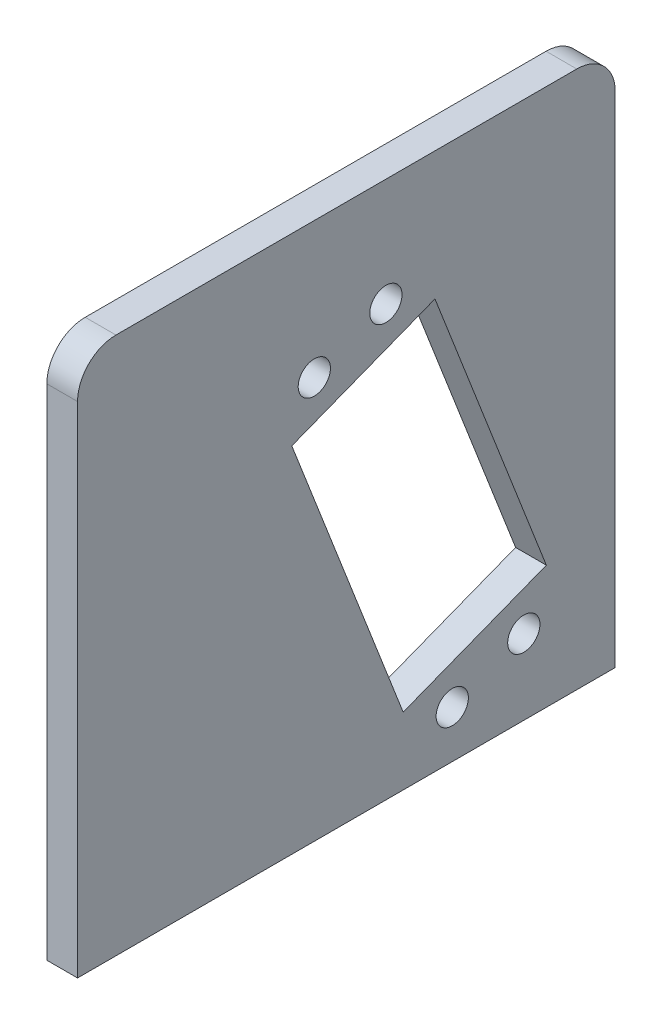
ISO-10303-21;
HEADER;
FILE_DESCRIPTION(('STEP AP214'),'2;1');
FILE_NAME('part.step','',(''),(''),'','','');
FILE_SCHEMA(('AUTOMOTIVE_DESIGN { 1 0 10303 214 1 1 1 1 }'));
ENDSEC;
DATA;
#1=APPLICATION_CONTEXT('core data for automotive mechanical design processes');
#2=APPLICATION_PROTOCOL_DEFINITION('international standard','automotive_design',2000,#1);
#3=PRODUCT_CONTEXT('',#1,'mechanical');
#4=PRODUCT('Part','Part','',(#3));
#5=PRODUCT_RELATED_PRODUCT_CATEGORY('part','',(#4));
#6=PRODUCT_DEFINITION_FORMATION('','',#4);
#7=PRODUCT_DEFINITION_CONTEXT('part definition',#1,'design');
#8=PRODUCT_DEFINITION('design','',#6,#7);
#9=PRODUCT_DEFINITION_SHAPE('','',#8);
#10=(LENGTH_UNIT() NAMED_UNIT(*) SI_UNIT(.MILLI.,.METRE.));
#11=(NAMED_UNIT(*) PLANE_ANGLE_UNIT() SI_UNIT($,.RADIAN.));
#12=(NAMED_UNIT(*) SI_UNIT($,.STERADIAN.) SOLID_ANGLE_UNIT());
#13=UNCERTAINTY_MEASURE_WITH_UNIT(LENGTH_MEASURE(1.E-05),#10,'distance_accuracy_value','');
#14=(GEOMETRIC_REPRESENTATION_CONTEXT(3) GLOBAL_UNCERTAINTY_ASSIGNED_CONTEXT((#13)) GLOBAL_UNIT_ASSIGNED_CONTEXT((#10,
#11,#12)) REPRESENTATION_CONTEXT('',''));
#15=CARTESIAN_POINT('',(0.,0.,0.));
#16=DIRECTION('',(0.,0.,1.));
#17=DIRECTION('',(1.,0.,0.));
#18=AXIS2_PLACEMENT_3D('',#15,#16,#17);
#19=CARTESIAN_POINT('',(0.,0.,0.));
#20=DIRECTION('',(0.,1.,0.));
#21=DIRECTION('',(0.,0.,1.));
#22=AXIS2_PLACEMENT_3D('',#19,#20,#21);
#23=PLANE('',#22);
#24=DIRECTION('',(0.,0.,1.));
#25=VECTOR('',#24,1.);
#26=CARTESIAN_POINT('',(35.2286949676816,0.,0.));
#27=LINE('',#26,#25);
#28=CARTESIAN_POINT('',(35.2286949676816,0.,-39.2125486187539));
#29=VERTEX_POINT('',#28);
#30=CARTESIAN_POINT('',(35.2286949676816,0.,30.7874513812461));
#31=VERTEX_POINT('',#30);
#32=EDGE_CURVE('E171',#29,#31,#27,.T.);
#33=ORIENTED_EDGE('',*,*,#32,.F.);
#34=DIRECTION('',(-1.,0.,0.));
#35=VECTOR('',#34,1.);
#36=CARTESIAN_POINT('',(0.,0.,-39.2125486187539));
#37=LINE('',#36,#35);
#38=CARTESIAN_POINT('',(39.2286949676816,0.,-39.2125486187539));
#39=VERTEX_POINT('',#38);
#40=EDGE_CURVE('E180',#39,#29,#37,.T.);
#41=ORIENTED_EDGE('',*,*,#40,.F.);
#42=DIRECTION('',(0.,0.,1.));
#43=VECTOR('',#42,1.);
#44=CARTESIAN_POINT('',(39.2286949676817,0.,0.));
#45=LINE('',#44,#43);
#46=CARTESIAN_POINT('',(39.2286949676817,0.,30.7874513812461));
#47=VERTEX_POINT('',#46);
#48=EDGE_CURVE('E177',#39,#47,#45,.T.);
#49=ORIENTED_EDGE('',*,*,#48,.T.);
#50=DIRECTION('',(1.,0.,0.));
#51=VECTOR('',#50,1.);
#52=CARTESIAN_POINT('',(0.,0.,30.7874513812461));
#53=LINE('',#52,#51);
#54=EDGE_CURVE('E174',#31,#47,#53,.T.);
#55=ORIENTED_EDGE('',*,*,#54,.F.);
#56=EDGE_LOOP('',(#33,#41,#49,#55));
#57=FACE_BOUND('',#56,.T.);
#58=ADVANCED_FACE('F37',(#57),#23,.F.);
#59=CARTESIAN_POINT('',(0.,3.,30.7874513812461));
#60=DIRECTION('',(0.,0.,-1.));
#61=DIRECTION('',(-1.,0.,0.));
#62=AXIS2_PLACEMENT_3D('',#59,#60,#61);
#63=PLANE('',#62);
#64=DIRECTION('',(0.,-1.,0.));
#65=VECTOR('',#64,1.);
#66=CARTESIAN_POINT('',(39.2286949676817,3.,30.7874513812461));
#67=LINE('',#66,#65);
#68=CARTESIAN_POINT('',(39.2286949676817,65.,30.7874513812461));
#69=VERTEX_POINT('',#68);
#70=EDGE_CURVE('E187',#69,#47,#67,.T.);
#71=ORIENTED_EDGE('',*,*,#70,.F.);
#72=DIRECTION('',(1.,0.,0.));
#73=VECTOR('',#72,1.);
#74=CARTESIAN_POINT('',(35.2286949676816,65.,30.7874513812461));
#75=LINE('',#74,#73);
#76=CARTESIAN_POINT('',(35.2286949676816,65.,30.7874513812461));
#77=VERTEX_POINT('',#76);
#78=EDGE_CURVE('E11',#69,#77,#75,.F.);
#79=ORIENTED_EDGE('',*,*,#78,.T.);
#80=DIRECTION('',(0.,-1.,0.));
#81=VECTOR('',#80,1.);
#82=CARTESIAN_POINT('',(35.2286949676816,3.,30.7874513812461));
#83=LINE('',#82,#81);
#84=EDGE_CURVE('E189',#77,#31,#83,.T.);
#85=ORIENTED_EDGE('',*,*,#84,.T.);
#86=ORIENTED_EDGE('',*,*,#54,.T.);
#87=EDGE_LOOP('',(#71,#79,#85,#86));
#88=FACE_BOUND('',#87,.T.);
#89=ADVANCED_FACE('F232',(#88),#63,.F.);
#90=CARTESIAN_POINT('',(0.,65.,25.7874513812461));
#91=DIRECTION('',(-1.,0.,0.));
#92=DIRECTION('',(0.,0.,1.));
#93=AXIS2_PLACEMENT_3D('',#90,#91,#92);
#94=CYLINDRICAL_SURFACE('',#93,5.);
#95=CARTESIAN_POINT('',(35.2286949676816,65.,25.7874513812461));
#96=DIRECTION('',(1.,0.,0.));
#97=DIRECTION('',(0.,0.,-1.));
#98=AXIS2_PLACEMENT_3D('',#95,#96,#97);
#99=CIRCLE('',#98,5.);
#100=CARTESIAN_POINT('',(35.2286949676816,70.,25.7874513812461));
#101=VERTEX_POINT('',#100);
#102=EDGE_CURVE('E197',#77,#101,#99,.F.);
#103=ORIENTED_EDGE('',*,*,#102,.F.);
#104=ORIENTED_EDGE('',*,*,#78,.F.);
#105=CARTESIAN_POINT('',(39.2286949676817,65.,25.7874513812461));
#106=DIRECTION('',(1.,0.,0.));
#107=DIRECTION('',(0.,0.,-1.));
#108=AXIS2_PLACEMENT_3D('',#105,#106,#107);
#109=CIRCLE('',#108,5.);
#110=CARTESIAN_POINT('',(39.2286949676817,70.,25.7874513812461));
#111=VERTEX_POINT('',#110);
#112=EDGE_CURVE('E203',#111,#69,#109,.T.);
#113=ORIENTED_EDGE('',*,*,#112,.F.);
#114=DIRECTION('',(1.,0.,0.));
#115=VECTOR('',#114,1.);
#116=CARTESIAN_POINT('',(39.2286949676817,70.,25.7874513812461));
#117=LINE('',#116,#115);
#118=EDGE_CURVE('E191',#101,#111,#117,.T.);
#119=ORIENTED_EDGE('',*,*,#118,.F.);
#120=EDGE_LOOP('',(#103,#104,#113,#119));
#121=FACE_BOUND('',#120,.T.);
#122=ADVANCED_FACE('F39',(#121),#94,.T.);
#123=CARTESIAN_POINT('',(0.,70.,0.));
#124=DIRECTION('',(0.,1.,0.));
#125=DIRECTION('',(0.,0.,1.));
#126=AXIS2_PLACEMENT_3D('',#123,#124,#125);
#127=PLANE('',#126);
#128=DIRECTION('',(0.,0.,1.));
#129=VECTOR('',#128,1.);
#130=CARTESIAN_POINT('',(39.2286949676816,70.,-39.2125486187539));
#131=LINE('',#130,#129);
#132=CARTESIAN_POINT('',(39.2286949676816,70.,-34.2125486187539));
#133=VERTEX_POINT('',#132);
#134=EDGE_CURVE('E168',#133,#111,#131,.T.);
#135=ORIENTED_EDGE('',*,*,#134,.F.);
#136=DIRECTION('',(-1.,0.,0.));
#137=VECTOR('',#136,1.);
#138=CARTESIAN_POINT('',(35.2286949676816,70.,-34.2125486187539));
#139=LINE('',#138,#137);
#140=CARTESIAN_POINT('',(35.2286949676816,70.,-34.2125486187539));
#141=VERTEX_POINT('',#140);
#142=EDGE_CURVE('E194',#133,#141,#139,.T.);
#143=ORIENTED_EDGE('',*,*,#142,.T.);
#144=DIRECTION('',(0.,0.,1.));
#145=VECTOR('',#144,1.);
#146=CARTESIAN_POINT('',(35.2286949676816,70.,-39.2125486187539));
#147=LINE('',#146,#145);
#148=EDGE_CURVE('E165',#141,#101,#147,.T.);
#149=ORIENTED_EDGE('',*,*,#148,.T.);
#150=ORIENTED_EDGE('',*,*,#118,.T.);
#151=EDGE_LOOP('',(#135,#143,#149,#150));
#152=FACE_BOUND('',#151,.T.);
#153=ADVANCED_FACE('F213',(#152),#127,.T.);
#154=CARTESIAN_POINT('',(0.,65.,-34.2125486187539));
#155=DIRECTION('',(1.,0.,0.));
#156=DIRECTION('',(0.,0.,-1.));
#157=AXIS2_PLACEMENT_3D('',#154,#155,#156);
#158=CYLINDRICAL_SURFACE('',#157,5.);
#159=CARTESIAN_POINT('',(39.2286949676817,65.,-34.2125486187539));
#160=DIRECTION('',(1.,0.,0.));
#161=DIRECTION('',(0.,0.,-1.));
#162=AXIS2_PLACEMENT_3D('',#159,#160,#161);
#163=CIRCLE('',#162,5.);
#164=CARTESIAN_POINT('',(39.2286949676816,65.,-39.2125486187539));
#165=VERTEX_POINT('',#164);
#166=EDGE_CURVE('E45',#165,#133,#163,.T.);
#167=ORIENTED_EDGE('',*,*,#166,.F.);
#168=DIRECTION('',(-1.,0.,0.));
#169=VECTOR('',#168,1.);
#170=CARTESIAN_POINT('',(39.2286949676816,65.,-39.2125486187539));
#171=LINE('',#170,#169);
#172=CARTESIAN_POINT('',(35.2286949676816,65.,-39.2125486187539));
#173=VERTEX_POINT('',#172);
#174=EDGE_CURVE('E201',#173,#165,#171,.F.);
#175=ORIENTED_EDGE('',*,*,#174,.F.);
#176=CARTESIAN_POINT('',(35.2286949676816,65.,-34.2125486187539));
#177=DIRECTION('',(1.,0.,0.));
#178=DIRECTION('',(0.,0.,-1.));
#179=AXIS2_PLACEMENT_3D('',#176,#177,#178);
#180=CIRCLE('',#179,5.);
#181=EDGE_CURVE('E199',#141,#173,#180,.F.);
#182=ORIENTED_EDGE('',*,*,#181,.F.);
#183=ORIENTED_EDGE('',*,*,#142,.F.);
#184=EDGE_LOOP('',(#167,#175,#182,#183));
#185=FACE_BOUND('',#184,.T.);
#186=ADVANCED_FACE('F216',(#185),#158,.T.);
#187=CARTESIAN_POINT('',(35.2286949676816,3.,0.));
#188=DIRECTION('',(1.,0.,0.));
#189=DIRECTION('',(0.,0.,-1.));
#190=AXIS2_PLACEMENT_3D('',#187,#188,#189);
#191=PLANE('',#190);
#192=CARTESIAN_POINT('',(35.2286949676816,52.301909762507,-0.0414603474612821));
#193=DIRECTION('',(1.,0.,0.));
#194=DIRECTION('',(0.,0.,-1.));
#195=AXIS2_PLACEMENT_3D('',#192,#193,#194);
#196=CIRCLE('',#195,2.1);
#197=CARTESIAN_POINT('',(35.2286949676816,52.301909762507,-2.14146034746128));
#198=VERTEX_POINT('',#197);
#199=EDGE_CURVE('E162',#198,#198,#196,.T.);
#200=ORIENTED_EDGE('',*,*,#199,.T.);
#201=EDGE_LOOP('',(#200));
#202=FACE_BOUND('',#201,.T.);
#203=DIRECTION('',(0.,-0.931942310142284,-0.362606578217581));
#204=VECTOR('',#203,1.);
#205=CARTESIAN_POINT('',(35.2286949676816,7.68336689755141,-12.036813527219));
#206=LINE('',#205,#204);
#207=CARTESIAN_POINT('',(35.2286949676816,46.0528314751418,2.89224389093444));
#208=VERTEX_POINT('',#207);
#209=CARTESIAN_POINT('',(35.2286949676816,8.77513906945046,-11.6120192377688));
#210=VERTEX_POINT('',#209);
#211=EDGE_CURVE('E156',#208,#210,#206,.T.);
#212=ORIENTED_EDGE('',*,*,#211,.T.);
#213=DIRECTION('',(0.,0.362606578217581,-0.931942310142284));
#214=VECTOR('',#213,1.);
#215=CARTESIAN_POINT('',(35.2286949676816,4.09177217189905,0.424794289450218));
#216=LINE('',#215,#214);
#217=CARTESIAN_POINT('',(35.2286949676816,16.0272706338021,-30.2508654406145));
#218=VERTEX_POINT('',#217);
#219=EDGE_CURVE('E159',#210,#218,#216,.T.);
#220=ORIENTED_EDGE('',*,*,#219,.T.);
#221=DIRECTION('',(0.,0.931942310142284,0.362606578217581));
#222=VECTOR('',#221,1.);
#223=CARTESIAN_POINT('',(35.2286949676816,14.935498461903,-30.6756597300647));
#224=LINE('',#223,#222);
#225=CARTESIAN_POINT('',(35.2286949676816,53.3049630394934,-15.7466023119112));
#226=VERTEX_POINT('',#225);
#227=EDGE_CURVE('E153',#218,#226,#224,.T.);
#228=ORIENTED_EDGE('',*,*,#227,.T.);
#229=DIRECTION('',(0.,-0.36260657821758,0.931942310142284));
#230=VECTOR('',#229,1.);
#231=CARTESIAN_POINT('',(35.2286949676816,41.3694645775904,14.9290574181534));
#232=LINE('',#231,#230);
#233=EDGE_CURVE('E119',#226,#208,#232,.T.);
#234=ORIENTED_EDGE('',*,*,#233,.T.);
#235=EDGE_LOOP('',(#212,#220,#228,#234));
#236=FACE_BOUND('',#235,.T.);
#237=CARTESIAN_POINT('',(35.2286949676816,9.77819234643688,-27.3171612022187));
#238=DIRECTION('',(1.,0.,0.));
#239=DIRECTION('',(0.,0.,-1.));
#240=AXIS2_PLACEMENT_3D('',#237,#238,#239);
#241=CIRCLE('',#240,2.09999999999999);
#242=CARTESIAN_POINT('',(35.2286949676816,9.77819234643688,-29.4171612022187));
#243=VERTEX_POINT('',#242);
#244=EDGE_CURVE('E150',#243,#243,#241,.T.);
#245=ORIENTED_EDGE('',*,*,#244,.T.);
#246=EDGE_LOOP('',(#245));
#247=FACE_BOUND('',#246,.T.);
#248=CARTESIAN_POINT('',(35.2286949676816,6.1521265642611,-17.9977381007959));
#249=DIRECTION('',(1.,0.,0.));
#250=DIRECTION('',(0.,0.,-1.));
#251=AXIS2_PLACEMENT_3D('',#248,#249,#250);
#252=CIRCLE('',#251,2.1);
#253=CARTESIAN_POINT('',(35.2286949676816,6.1521265642611,-20.0977381007959));
#254=VERTEX_POINT('',#253);
#255=EDGE_CURVE('E147',#254,#254,#252,.T.);
#256=ORIENTED_EDGE('',*,*,#255,.T.);
#257=EDGE_LOOP('',(#256));
#258=FACE_BOUND('',#257,.T.);
#259=CARTESIAN_POINT('',(35.2286949676816,55.9279755446828,-9.36088344888414));
#260=DIRECTION('',(1.,0.,0.));
#261=DIRECTION('',(0.,0.,-1.));
#262=AXIS2_PLACEMENT_3D('',#259,#260,#261);
#263=CIRCLE('',#262,2.1);
#264=CARTESIAN_POINT('',(35.2286949676816,55.9279755446828,-11.4608834488841));
#265=VERTEX_POINT('',#264);
#266=EDGE_CURVE('E144',#265,#265,#263,.T.);
#267=ORIENTED_EDGE('',*,*,#266,.T.);
#268=EDGE_LOOP('',(#267));
#269=FACE_BOUND('',#268,.T.);
#270=ORIENTED_EDGE('',*,*,#148,.F.);
#271=ORIENTED_EDGE('',*,*,#181,.T.);
#272=DIRECTION('',(0.,-1.,0.));
#273=VECTOR('',#272,1.);
#274=CARTESIAN_POINT('',(35.2286949676816,3.,-39.2125486187539));
#275=LINE('',#274,#273);
#276=EDGE_CURVE('E183',#173,#29,#275,.T.);
#277=ORIENTED_EDGE('',*,*,#276,.T.);
#278=ORIENTED_EDGE('',*,*,#32,.T.);
#279=ORIENTED_EDGE('',*,*,#84,.F.);
#280=ORIENTED_EDGE('',*,*,#102,.T.);
#281=EDGE_LOOP('',(#270,#271,#277,#278,#279,#280));
#282=FACE_BOUND('',#281,.T.);
#283=ADVANCED_FACE('F219',(#202,#236,#247,#258,#269,#282),#191,.F.);
#284=CARTESIAN_POINT('',(0.,3.,-39.2125486187539));
#285=DIRECTION('',(0.,0.,1.));
#286=DIRECTION('',(1.,0.,0.));
#287=AXIS2_PLACEMENT_3D('',#284,#285,#286);
#288=PLANE('',#287);
#289=ORIENTED_EDGE('',*,*,#276,.F.);
#290=ORIENTED_EDGE('',*,*,#174,.T.);
#291=DIRECTION('',(0.,-1.,0.));
#292=VECTOR('',#291,1.);
#293=CARTESIAN_POINT('',(39.2286949676816,3.,-39.2125486187539));
#294=LINE('',#293,#292);
#295=EDGE_CURVE('E185',#165,#39,#294,.T.);
#296=ORIENTED_EDGE('',*,*,#295,.T.);
#297=ORIENTED_EDGE('',*,*,#40,.T.);
#298=EDGE_LOOP('',(#289,#290,#296,#297));
#299=FACE_BOUND('',#298,.T.);
#300=ADVANCED_FACE('F221',(#299),#288,.F.);
#301=CARTESIAN_POINT('',(39.2286949676817,3.,0.));
#302=DIRECTION('',(1.,0.,0.));
#303=DIRECTION('',(0.,0.,-1.));
#304=AXIS2_PLACEMENT_3D('',#301,#302,#303);
#305=PLANE('',#304);
#306=CARTESIAN_POINT('',(39.2286949676817,52.301909762507,-0.0414603474612825));
#307=DIRECTION('',(1.,0.,0.));
#308=DIRECTION('',(0.,0.,-1.));
#309=AXIS2_PLACEMENT_3D('',#306,#307,#308);
#310=CIRCLE('',#309,2.1);
#311=CARTESIAN_POINT('',(39.2286949676817,52.301909762507,-2.14146034746128));
#312=VERTEX_POINT('',#311);
#313=EDGE_CURVE('E267',#312,#312,#310,.T.);
#314=ORIENTED_EDGE('',*,*,#313,.F.);
#315=EDGE_LOOP('',(#314));
#316=FACE_BOUND('',#315,.T.);
#317=DIRECTION('',(0.,0.362606578217581,-0.931942310142284));
#318=VECTOR('',#317,1.);
#319=CARTESIAN_POINT('',(39.2286949676817,16.0272706338021,-30.2508654406145));
#320=LINE('',#319,#318);
#321=CARTESIAN_POINT('',(39.2286949676817,8.77513906945046,-11.6120192377688));
#322=VERTEX_POINT('',#321);
#323=CARTESIAN_POINT('',(39.2286949676817,16.0272706338021,-30.2508654406145));
#324=VERTEX_POINT('',#323);
#325=EDGE_CURVE('E60',#322,#324,#320,.T.);
#326=ORIENTED_EDGE('',*,*,#325,.F.);
#327=DIRECTION('',(0.,-0.931942310142284,-0.362606578217581));
#328=VECTOR('',#327,1.);
#329=CARTESIAN_POINT('',(39.2286949676817,8.77513906945046,-11.6120192377688));
#330=LINE('',#329,#328);
#331=CARTESIAN_POINT('',(39.2286949676817,46.0528314751418,2.89224389093444));
#332=VERTEX_POINT('',#331);
#333=EDGE_CURVE('E132',#332,#322,#330,.T.);
#334=ORIENTED_EDGE('',*,*,#333,.F.);
#335=DIRECTION('',(0.,-0.36260657821758,0.931942310142284));
#336=VECTOR('',#335,1.);
#337=CARTESIAN_POINT('',(39.2286949676817,46.0528314751418,2.89224389093444));
#338=LINE('',#337,#336);
#339=CARTESIAN_POINT('',(39.2286949676817,53.3049630394935,-15.7466023119112));
#340=VERTEX_POINT('',#339);
#341=EDGE_CURVE('E116',#340,#332,#338,.T.);
#342=ORIENTED_EDGE('',*,*,#341,.F.);
#343=DIRECTION('',(0.,0.931942310142284,0.362606578217581));
#344=VECTOR('',#343,1.);
#345=CARTESIAN_POINT('',(39.2286949676817,53.3049630394935,-15.7466023119112));
#346=LINE('',#345,#344);
#347=EDGE_CURVE('E125',#324,#340,#346,.T.);
#348=ORIENTED_EDGE('',*,*,#347,.F.);
#349=EDGE_LOOP('',(#326,#334,#342,#348));
#350=FACE_BOUND('',#349,.T.);
#351=CARTESIAN_POINT('',(39.2286949676817,9.77819234643688,-27.3171612022187));
#352=DIRECTION('',(1.,0.,0.));
#353=DIRECTION('',(0.,0.,1.));
#354=AXIS2_PLACEMENT_3D('',#351,#352,#353);
#355=CIRCLE('',#354,2.09999999999999);
#356=CARTESIAN_POINT('',(39.2286949676817,9.77819234643688,-25.2171612022187));
#357=VERTEX_POINT('',#356);
#358=EDGE_CURVE('E269',#357,#357,#355,.T.);
#359=ORIENTED_EDGE('',*,*,#358,.F.);
#360=EDGE_LOOP('',(#359));
#361=FACE_BOUND('',#360,.T.);
#362=CARTESIAN_POINT('',(39.2286949676817,6.1521265642611,-17.9977381007959));
#363=DIRECTION('',(1.,0.,0.));
#364=DIRECTION('',(0.,0.,1.));
#365=AXIS2_PLACEMENT_3D('',#362,#363,#364);
#366=CIRCLE('',#365,2.1);
#367=CARTESIAN_POINT('',(39.2286949676817,6.1521265642611,-15.8977381007959));
#368=VERTEX_POINT('',#367);
#369=EDGE_CURVE('E272',#368,#368,#366,.T.);
#370=ORIENTED_EDGE('',*,*,#369,.F.);
#371=EDGE_LOOP('',(#370));
#372=FACE_BOUND('',#371,.T.);
#373=CARTESIAN_POINT('',(39.2286949676817,55.9279755446828,-9.36088344888414));
#374=DIRECTION('',(1.,0.,0.));
#375=DIRECTION('',(0.,0.,-1.));
#376=AXIS2_PLACEMENT_3D('',#373,#374,#375);
#377=CIRCLE('',#376,2.1);
#378=CARTESIAN_POINT('',(39.2286949676817,55.9279755446828,-11.4608834488841));
#379=VERTEX_POINT('',#378);
#380=EDGE_CURVE('E139',#379,#379,#377,.T.);
#381=ORIENTED_EDGE('',*,*,#380,.F.);
#382=EDGE_LOOP('',(#381));
#383=FACE_BOUND('',#382,.T.);
#384=ORIENTED_EDGE('',*,*,#295,.F.);
#385=ORIENTED_EDGE('',*,*,#166,.T.);
#386=ORIENTED_EDGE('',*,*,#134,.T.);
#387=ORIENTED_EDGE('',*,*,#112,.T.);
#388=ORIENTED_EDGE('',*,*,#70,.T.);
#389=ORIENTED_EDGE('',*,*,#48,.F.);
#390=EDGE_LOOP('',(#384,#385,#386,#387,#388,#389));
#391=FACE_BOUND('',#390,.T.);
#392=ADVANCED_FACE('F129',(#316,#350,#361,#372,#383,#391),#305,.T.);
#393=CARTESIAN_POINT('',(29.2286949676817,55.9279755446828,-9.36088344888414));
#394=DIRECTION('',(1.,0.,0.));
#395=DIRECTION('',(0.,0.,-1.));
#396=AXIS2_PLACEMENT_3D('',#393,#394,#395);
#397=CYLINDRICAL_SURFACE('',#396,2.1);
#398=ORIENTED_EDGE('',*,*,#380,.T.);
#399=EDGE_LOOP('',(#398));
#400=FACE_BOUND('',#399,.T.);
#401=ORIENTED_EDGE('',*,*,#266,.F.);
#402=EDGE_LOOP('',(#401));
#403=FACE_BOUND('',#402,.T.);
#404=ADVANCED_FACE('F253',(#400,#403),#397,.F.);
#405=CARTESIAN_POINT('',(29.2286949676817,6.1521265642611,-17.9977381007959));
#406=DIRECTION('',(1.,0.,0.));
#407=DIRECTION('',(0.,0.,-1.));
#408=AXIS2_PLACEMENT_3D('',#405,#406,#407);
#409=CYLINDRICAL_SURFACE('',#408,2.1);
#410=ORIENTED_EDGE('',*,*,#369,.T.);
#411=EDGE_LOOP('',(#410));
#412=FACE_BOUND('',#411,.T.);
#413=ORIENTED_EDGE('',*,*,#255,.F.);
#414=EDGE_LOOP('',(#413));
#415=FACE_BOUND('',#414,.T.);
#416=ADVANCED_FACE('F263',(#412,#415),#409,.F.);
#417=CARTESIAN_POINT('',(29.2286949676817,9.77819234643688,-27.3171612022187));
#418=DIRECTION('',(1.,0.,0.));
#419=DIRECTION('',(0.,0.,-1.));
#420=AXIS2_PLACEMENT_3D('',#417,#418,#419);
#421=CYLINDRICAL_SURFACE('',#420,2.09999999999999);
#422=ORIENTED_EDGE('',*,*,#358,.T.);
#423=EDGE_LOOP('',(#422));
#424=FACE_BOUND('',#423,.T.);
#425=ORIENTED_EDGE('',*,*,#244,.F.);
#426=EDGE_LOOP('',(#425));
#427=FACE_BOUND('',#426,.T.);
#428=ADVANCED_FACE('F286',(#424,#427),#421,.F.);
#429=CARTESIAN_POINT('',(29.2286949676817,16.0272706338021,-30.2508654406145));
#430=DIRECTION('',(0.,-0.931942310142284,-0.362606578217581));
#431=DIRECTION('',(0.,0.362606578217581,-0.931942310142284));
#432=AXIS2_PLACEMENT_3D('',#429,#430,#431);
#433=PLANE('',#432);
#434=DIRECTION('',(1.,0.,0.));
#435=VECTOR('',#434,1.);
#436=CARTESIAN_POINT('',(29.2286949676817,8.77513906945046,-11.6120192377688));
#437=LINE('',#436,#435);
#438=EDGE_CURVE('E137',#210,#322,#437,.T.);
#439=ORIENTED_EDGE('',*,*,#438,.T.);
#440=ORIENTED_EDGE('',*,*,#325,.T.);
#441=DIRECTION('',(1.,0.,0.));
#442=VECTOR('',#441,1.);
#443=CARTESIAN_POINT('',(29.2286949676817,16.0272706338021,-30.2508654406145));
#444=LINE('',#443,#442);
#445=EDGE_CURVE('E122',#218,#324,#444,.T.);
#446=ORIENTED_EDGE('',*,*,#445,.F.);
#447=ORIENTED_EDGE('',*,*,#219,.F.);
#448=EDGE_LOOP('',(#439,#440,#446,#447));
#449=FACE_BOUND('',#448,.T.);
#450=ADVANCED_FACE('F293',(#449),#433,.F.);
#451=CARTESIAN_POINT('',(29.2286949676817,8.77513906945046,-11.6120192377688));
#452=DIRECTION('',(0.,-0.362606578217581,0.931942310142284));
#453=DIRECTION('',(0.,-0.931942310142284,-0.362606578217581));
#454=AXIS2_PLACEMENT_3D('',#451,#452,#453);
#455=PLANE('',#454);
#456=DIRECTION('',(1.,0.,0.));
#457=VECTOR('',#456,1.);
#458=CARTESIAN_POINT('',(29.2286949676817,46.0528314751418,2.89224389093444));
#459=LINE('',#458,#457);
#460=EDGE_CURVE('E121',#208,#332,#459,.T.);
#461=ORIENTED_EDGE('',*,*,#460,.T.);
#462=ORIENTED_EDGE('',*,*,#333,.T.);
#463=ORIENTED_EDGE('',*,*,#438,.F.);
#464=ORIENTED_EDGE('',*,*,#211,.F.);
#465=EDGE_LOOP('',(#461,#462,#463,#464));
#466=FACE_BOUND('',#465,.T.);
#467=ADVANCED_FACE('F300',(#466),#455,.F.);
#468=CARTESIAN_POINT('',(29.2286949676817,46.0528314751418,2.89224389093444));
#469=DIRECTION('',(0.,0.931942310142284,0.36260657821758));
#470=DIRECTION('',(0.,-0.36260657821758,0.931942310142284));
#471=AXIS2_PLACEMENT_3D('',#468,#469,#470);
#472=PLANE('',#471);
#473=DIRECTION('',(1.,0.,0.));
#474=VECTOR('',#473,1.);
#475=CARTESIAN_POINT('',(29.2286949676817,53.3049630394935,-15.7466023119112));
#476=LINE('',#475,#474);
#477=EDGE_CURVE('E52',#226,#340,#476,.T.);
#478=ORIENTED_EDGE('',*,*,#477,.T.);
#479=ORIENTED_EDGE('',*,*,#341,.T.);
#480=ORIENTED_EDGE('',*,*,#460,.F.);
#481=ORIENTED_EDGE('',*,*,#233,.F.);
#482=EDGE_LOOP('',(#478,#479,#480,#481));
#483=FACE_BOUND('',#482,.T.);
#484=ADVANCED_FACE('F113',(#483),#472,.F.);
#485=CARTESIAN_POINT('',(29.2286949676817,53.3049630394935,-15.7466023119112));
#486=DIRECTION('',(0.,0.362606578217581,-0.931942310142284));
#487=DIRECTION('',(0.,0.931942310142284,0.362606578217581));
#488=AXIS2_PLACEMENT_3D('',#485,#486,#487);
#489=PLANE('',#488);
#490=ORIENTED_EDGE('',*,*,#445,.T.);
#491=ORIENTED_EDGE('',*,*,#347,.T.);
#492=ORIENTED_EDGE('',*,*,#477,.F.);
#493=ORIENTED_EDGE('',*,*,#227,.F.);
#494=EDGE_LOOP('',(#490,#491,#492,#493));
#495=FACE_BOUND('',#494,.T.);
#496=ADVANCED_FACE('F126',(#495),#489,.F.);
#497=CARTESIAN_POINT('',(29.2286949676817,52.301909762507,-0.0414603474612815));
#498=DIRECTION('',(1.,0.,0.));
#499=DIRECTION('',(0.,0.,-1.));
#500=AXIS2_PLACEMENT_3D('',#497,#498,#499);
#501=CYLINDRICAL_SURFACE('',#500,2.1);
#502=ORIENTED_EDGE('',*,*,#313,.T.);
#503=EDGE_LOOP('',(#502));
#504=FACE_BOUND('',#503,.T.);
#505=ORIENTED_EDGE('',*,*,#199,.F.);
#506=EDGE_LOOP('',(#505));
#507=FACE_BOUND('',#506,.T.);
#508=ADVANCED_FACE('F297',(#504,#507),#501,.F.);
#509=CLOSED_SHELL('',(#58,#89,#122,#153,#186,#283,#300,#392,#404,#416,#428,#450,#467,#484,#496,#508));
#510=MANIFOLD_SOLID_BREP('B2',#509);
#511=ADVANCED_BREP_SHAPE_REPRESENTATION('',(#18,#510),#14);
#512=SHAPE_DEFINITION_REPRESENTATION(#9,#511);
ENDSEC;
END-ISO-10303-21;
